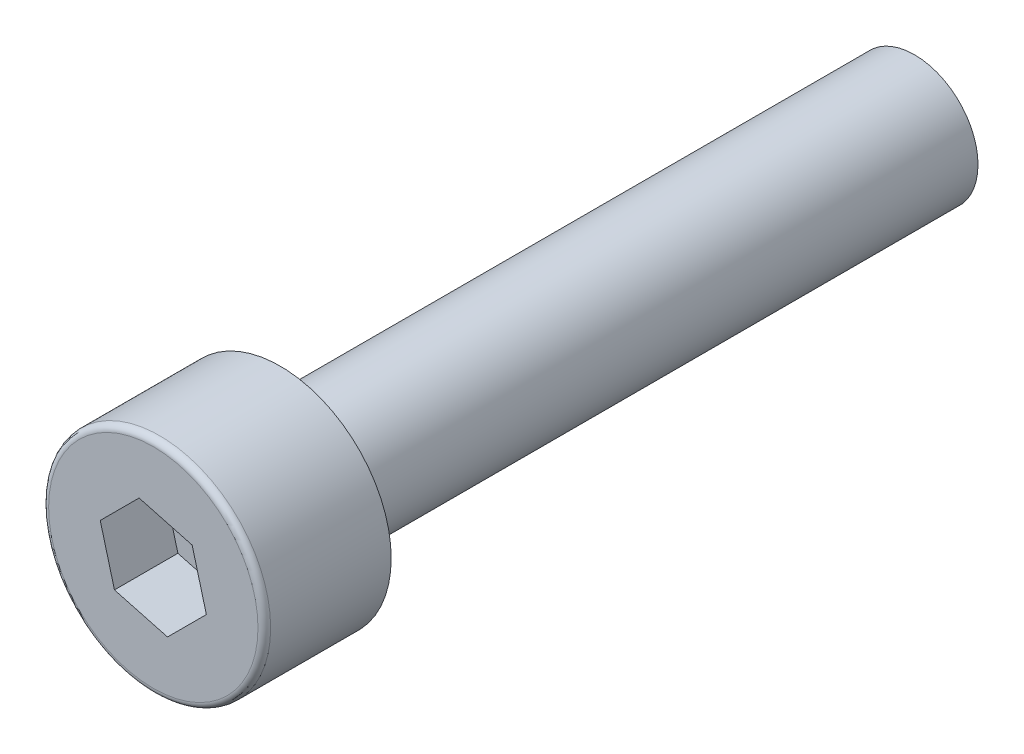
ISO-10303-21;
HEADER;
FILE_DESCRIPTION(('STEP AP214'),'2;1');
FILE_NAME('part.step','',(''),(''),'','','');
FILE_SCHEMA(('AUTOMOTIVE_DESIGN { 1 0 10303 214 1 1 1 1 }'));
ENDSEC;
DATA;
#1=APPLICATION_CONTEXT('core data for automotive mechanical design processes');
#2=APPLICATION_PROTOCOL_DEFINITION('international standard','automotive_design',2000,#1);
#3=PRODUCT_CONTEXT('',#1,'mechanical');
#4=PRODUCT('Part','Part','',(#3));
#5=PRODUCT_RELATED_PRODUCT_CATEGORY('part','',(#4));
#6=PRODUCT_DEFINITION_FORMATION('','',#4);
#7=PRODUCT_DEFINITION_CONTEXT('part definition',#1,'design');
#8=PRODUCT_DEFINITION('design','',#6,#7);
#9=PRODUCT_DEFINITION_SHAPE('','',#8);
#10=(LENGTH_UNIT() NAMED_UNIT(*) SI_UNIT(.MILLI.,.METRE.));
#11=(NAMED_UNIT(*) PLANE_ANGLE_UNIT() SI_UNIT($,.RADIAN.));
#12=(NAMED_UNIT(*) SI_UNIT($,.STERADIAN.) SOLID_ANGLE_UNIT());
#13=UNCERTAINTY_MEASURE_WITH_UNIT(LENGTH_MEASURE(1.E-05),#10,'distance_accuracy_value','');
#14=(GEOMETRIC_REPRESENTATION_CONTEXT(3) GLOBAL_UNCERTAINTY_ASSIGNED_CONTEXT((#13)) GLOBAL_UNIT_ASSIGNED_CONTEXT((#10,
#11,#12)) REPRESENTATION_CONTEXT('',''));
#15=CARTESIAN_POINT('',(0.,0.,0.));
#16=DIRECTION('',(0.,0.,1.));
#17=DIRECTION('',(1.,0.,0.));
#18=AXIS2_PLACEMENT_3D('',#15,#16,#17);
#19=CARTESIAN_POINT('',(0.,0.,0.));
#20=DIRECTION('',(0.,0.,1.));
#21=DIRECTION('',(1.,0.,0.));
#22=AXIS2_PLACEMENT_3D('',#19,#20,#21);
#23=PLANE('',#22);
#24=CARTESIAN_POINT('',(0.,0.,0.));
#25=DIRECTION('',(0.,0.,1.));
#26=DIRECTION('',(1.,0.,0.));
#27=AXIS2_PLACEMENT_3D('',#24,#25,#26);
#28=CIRCLE('',#27,3.5);
#29=CARTESIAN_POINT('',(3.5,0.,0.));
#30=VERTEX_POINT('',#29);
#31=EDGE_CURVE('E137',#30,#30,#28,.T.);
#32=ORIENTED_EDGE('',*,*,#31,.F.);
#33=EDGE_LOOP('',(#32));
#34=FACE_BOUND('',#33,.T.);
#35=CARTESIAN_POINT('',(0.,0.,0.));
#36=DIRECTION('',(0.,0.,1.));
#37=DIRECTION('',(1.,0.,0.));
#38=AXIS2_PLACEMENT_3D('',#35,#36,#37);
#39=CIRCLE('',#38,2.);
#40=CARTESIAN_POINT('',(2.,0.,0.));
#41=VERTEX_POINT('',#40);
#42=EDGE_CURVE('E145',#41,#41,#39,.F.);
#43=ORIENTED_EDGE('',*,*,#42,.F.);
#44=EDGE_LOOP('',(#43));
#45=FACE_BOUND('',#44,.T.);
#46=ADVANCED_FACE('F34',(#34,#45),#23,.F.);
#47=CARTESIAN_POINT('',(0.,0.,4.));
#48=DIRECTION('',(0.,0.,-1.));
#49=DIRECTION('',(-1.,0.,0.));
#50=AXIS2_PLACEMENT_3D('',#47,#48,#49);
#51=CYLINDRICAL_SURFACE('',#50,3.5);
#52=CARTESIAN_POINT('',(0.,0.,3.8));
#53=DIRECTION('',(0.,0.,1.));
#54=DIRECTION('',(1.,0.,0.));
#55=AXIS2_PLACEMENT_3D('',#52,#53,#54);
#56=CIRCLE('',#55,3.5);
#57=CARTESIAN_POINT('',(3.5,0.,3.8));
#58=VERTEX_POINT('',#57);
#59=EDGE_CURVE('E11',#58,#58,#56,.F.);
#60=ORIENTED_EDGE('',*,*,#59,.T.);
#61=EDGE_LOOP('',(#60));
#62=FACE_BOUND('',#61,.T.);
#63=ORIENTED_EDGE('',*,*,#31,.T.);
#64=EDGE_LOOP('',(#63));
#65=FACE_BOUND('',#64,.T.);
#66=ADVANCED_FACE('F164',(#62,#65),#51,.T.);
#67=CARTESIAN_POINT('',(0.,0.,4.));
#68=DIRECTION('',(0.,0.,1.));
#69=DIRECTION('',(1.,0.,0.));
#70=AXIS2_PLACEMENT_3D('',#67,#68,#69);
#71=PLANE('',#70);
#72=CARTESIAN_POINT('',(0.,0.,4.));
#73=DIRECTION('',(0.,0.,1.));
#74=DIRECTION('',(1.,0.,0.));
#75=AXIS2_PLACEMENT_3D('',#72,#73,#74);
#76=CIRCLE('',#75,3.3);
#77=CARTESIAN_POINT('',(3.3,0.,4.));
#78=VERTEX_POINT('',#77);
#79=EDGE_CURVE('E42',#78,#78,#76,.T.);
#80=ORIENTED_EDGE('',*,*,#79,.T.);
#81=EDGE_LOOP('',(#80));
#82=FACE_BOUND('',#81,.T.);
#83=DIRECTION('',(0.258819045102521,-0.965925826289068,0.));
#84=VECTOR('',#83,1.);
#85=CARTESIAN_POINT('',(-1.67303260747562,0.448287736084027,4.));
#86=LINE('',#85,#84);
#87=CARTESIAN_POINT('',(-1.67303260747562,0.448287736084027,4.));
#88=VERTEX_POINT('',#87);
#89=CARTESIAN_POINT('',(-1.22474487139159,-1.22474487139159,4.));
#90=VERTEX_POINT('',#89);
#91=EDGE_CURVE('E49',#88,#90,#86,.T.);
#92=ORIENTED_EDGE('',*,*,#91,.F.);
#93=DIRECTION('',(-0.707106781186547,-0.707106781186548,0.));
#94=VECTOR('',#93,1.);
#95=CARTESIAN_POINT('',(-0.448287736084027,1.67303260747562,4.));
#96=LINE('',#95,#94);
#97=CARTESIAN_POINT('',(-0.448287736084027,1.67303260747562,4.));
#98=VERTEX_POINT('',#97);
#99=EDGE_CURVE('E133',#98,#88,#96,.T.);
#100=ORIENTED_EDGE('',*,*,#99,.F.);
#101=DIRECTION('',(-0.965925826289068,0.258819045102521,0.));
#102=VECTOR('',#101,1.);
#103=CARTESIAN_POINT('',(1.22474487139159,1.22474487139159,4.));
#104=LINE('',#103,#102);
#105=CARTESIAN_POINT('',(1.22474487139159,1.22474487139159,4.));
#106=VERTEX_POINT('',#105);
#107=EDGE_CURVE('E131',#106,#98,#104,.T.);
#108=ORIENTED_EDGE('',*,*,#107,.F.);
#109=DIRECTION('',(-0.258819045102521,0.965925826289068,0.));
#110=VECTOR('',#109,1.);
#111=CARTESIAN_POINT('',(1.67303260747562,-0.448287736084027,4.));
#112=LINE('',#111,#110);
#113=CARTESIAN_POINT('',(1.67303260747562,-0.448287736084027,4.));
#114=VERTEX_POINT('',#113);
#115=EDGE_CURVE('E97',#114,#106,#112,.T.);
#116=ORIENTED_EDGE('',*,*,#115,.F.);
#117=DIRECTION('',(0.707106781186547,0.707106781186548,0.));
#118=VECTOR('',#117,1.);
#119=CARTESIAN_POINT('',(0.448287736084026,-1.67303260747562,4.));
#120=LINE('',#119,#118);
#121=CARTESIAN_POINT('',(0.448287736084026,-1.67303260747562,4.));
#122=VERTEX_POINT('',#121);
#123=EDGE_CURVE('E127',#122,#114,#120,.T.);
#124=ORIENTED_EDGE('',*,*,#123,.F.);
#125=DIRECTION('',(0.965925826289068,-0.258819045102521,0.));
#126=VECTOR('',#125,1.);
#127=CARTESIAN_POINT('',(-1.22474487139159,-1.22474487139159,4.));
#128=LINE('',#127,#126);
#129=EDGE_CURVE('E123',#90,#122,#128,.T.);
#130=ORIENTED_EDGE('',*,*,#129,.F.);
#131=EDGE_LOOP('',(#92,#100,#108,#116,#124,#130));
#132=FACE_BOUND('',#131,.T.);
#133=ADVANCED_FACE('F150',(#82,#132),#71,.T.);
#134=CARTESIAN_POINT('',(-1.67303260747562,0.448287736084027,2.));
#135=DIRECTION('',(-0.965925826289068,-0.258819045102521,0.));
#136=DIRECTION('',(0.258819045102521,-0.965925826289068,0.));
#137=AXIS2_PLACEMENT_3D('',#134,#135,#136);
#138=PLANE('',#137);
#139=ORIENTED_EDGE('',*,*,#91,.T.);
#140=DIRECTION('',(0.,0.,1.));
#141=VECTOR('',#140,1.);
#142=CARTESIAN_POINT('',(-1.22474487139159,-1.22474487139159,2.));
#143=LINE('',#142,#141);
#144=CARTESIAN_POINT('',(-1.22474487139159,-1.22474487139159,2.));
#145=VERTEX_POINT('',#144);
#146=EDGE_CURVE('E79',#145,#90,#143,.T.);
#147=ORIENTED_EDGE('',*,*,#146,.F.);
#148=DIRECTION('',(0.258819045102521,-0.965925826289068,0.));
#149=VECTOR('',#148,1.);
#150=CARTESIAN_POINT('',(-1.67303260747562,0.448287736084027,2.));
#151=LINE('',#150,#149);
#152=CARTESIAN_POINT('',(-1.67303260747562,0.448287736084027,2.));
#153=VERTEX_POINT('',#152);
#154=EDGE_CURVE('E135',#153,#145,#151,.T.);
#155=ORIENTED_EDGE('',*,*,#154,.F.);
#156=DIRECTION('',(0.,0.,1.));
#157=VECTOR('',#156,1.);
#158=CARTESIAN_POINT('',(-1.67303260747562,0.448287736084027,2.));
#159=LINE('',#158,#157);
#160=EDGE_CURVE('E57',#153,#88,#159,.T.);
#161=ORIENTED_EDGE('',*,*,#160,.T.);
#162=EDGE_LOOP('',(#139,#147,#155,#161));
#163=FACE_BOUND('',#162,.T.);
#164=ADVANCED_FACE('F176',(#163),#138,.F.);
#165=CARTESIAN_POINT('',(-0.448287736084027,1.67303260747562,2.));
#166=DIRECTION('',(-0.707106781186548,0.707106781186547,0.));
#167=DIRECTION('',(-0.707106781186547,-0.707106781186548,0.));
#168=AXIS2_PLACEMENT_3D('',#165,#166,#167);
#169=PLANE('',#168);
#170=ORIENTED_EDGE('',*,*,#99,.T.);
#171=ORIENTED_EDGE('',*,*,#160,.F.);
#172=DIRECTION('',(-0.707106781186547,-0.707106781186548,0.));
#173=VECTOR('',#172,1.);
#174=CARTESIAN_POINT('',(-0.448287736084027,1.67303260747562,2.));
#175=LINE('',#174,#173);
#176=CARTESIAN_POINT('',(-0.448287736084027,1.67303260747562,2.));
#177=VERTEX_POINT('',#176);
#178=EDGE_CURVE('E109',#177,#153,#175,.T.);
#179=ORIENTED_EDGE('',*,*,#178,.F.);
#180=DIRECTION('',(0.,0.,1.));
#181=VECTOR('',#180,1.);
#182=CARTESIAN_POINT('',(-0.448287736084027,1.67303260747562,2.));
#183=LINE('',#182,#181);
#184=EDGE_CURVE('E101',#177,#98,#183,.T.);
#185=ORIENTED_EDGE('',*,*,#184,.T.);
#186=EDGE_LOOP('',(#170,#171,#179,#185));
#187=FACE_BOUND('',#186,.T.);
#188=ADVANCED_FACE('F179',(#187),#169,.F.);
#189=CARTESIAN_POINT('',(1.22474487139159,1.22474487139159,2.));
#190=DIRECTION('',(0.258819045102521,0.965925826289068,0.));
#191=DIRECTION('',(-0.965925826289068,0.258819045102521,0.));
#192=AXIS2_PLACEMENT_3D('',#189,#190,#191);
#193=PLANE('',#192);
#194=ORIENTED_EDGE('',*,*,#107,.T.);
#195=ORIENTED_EDGE('',*,*,#184,.F.);
#196=DIRECTION('',(-0.965925826289068,0.258819045102521,0.));
#197=VECTOR('',#196,1.);
#198=CARTESIAN_POINT('',(1.22474487139159,1.22474487139159,2.));
#199=LINE('',#198,#197);
#200=CARTESIAN_POINT('',(1.22474487139159,1.22474487139159,2.));
#201=VERTEX_POINT('',#200);
#202=EDGE_CURVE('E105',#201,#177,#199,.T.);
#203=ORIENTED_EDGE('',*,*,#202,.F.);
#204=DIRECTION('',(0.,0.,1.));
#205=VECTOR('',#204,1.);
#206=CARTESIAN_POINT('',(1.22474487139159,1.22474487139159,2.));
#207=LINE('',#206,#205);
#208=EDGE_CURVE('E90',#201,#106,#207,.T.);
#209=ORIENTED_EDGE('',*,*,#208,.T.);
#210=EDGE_LOOP('',(#194,#195,#203,#209));
#211=FACE_BOUND('',#210,.T.);
#212=ADVANCED_FACE('F106',(#211),#193,.F.);
#213=CARTESIAN_POINT('',(1.67303260747562,-0.448287736084027,2.));
#214=DIRECTION('',(0.965925826289068,0.258819045102521,0.));
#215=DIRECTION('',(-0.258819045102521,0.965925826289068,0.));
#216=AXIS2_PLACEMENT_3D('',#213,#214,#215);
#217=PLANE('',#216);
#218=ORIENTED_EDGE('',*,*,#115,.T.);
#219=ORIENTED_EDGE('',*,*,#208,.F.);
#220=DIRECTION('',(-0.258819045102521,0.965925826289068,0.));
#221=VECTOR('',#220,1.);
#222=CARTESIAN_POINT('',(1.67303260747562,-0.448287736084027,2.));
#223=LINE('',#222,#221);
#224=CARTESIAN_POINT('',(1.67303260747562,-0.448287736084027,2.));
#225=VERTEX_POINT('',#224);
#226=EDGE_CURVE('E94',#225,#201,#223,.T.);
#227=ORIENTED_EDGE('',*,*,#226,.F.);
#228=DIRECTION('',(0.,0.,1.));
#229=VECTOR('',#228,1.);
#230=CARTESIAN_POINT('',(1.67303260747562,-0.448287736084027,2.));
#231=LINE('',#230,#229);
#232=EDGE_CURVE('E102',#225,#114,#231,.T.);
#233=ORIENTED_EDGE('',*,*,#232,.T.);
#234=EDGE_LOOP('',(#218,#219,#227,#233));
#235=FACE_BOUND('',#234,.T.);
#236=ADVANCED_FACE('F92',(#235),#217,.F.);
#237=CARTESIAN_POINT('',(0.448287736084026,-1.67303260747562,2.));
#238=DIRECTION('',(0.707106781186548,-0.707106781186547,0.));
#239=DIRECTION('',(0.707106781186547,0.707106781186548,0.));
#240=AXIS2_PLACEMENT_3D('',#237,#238,#239);
#241=PLANE('',#240);
#242=ORIENTED_EDGE('',*,*,#123,.T.);
#243=ORIENTED_EDGE('',*,*,#232,.F.);
#244=DIRECTION('',(0.707106781186547,0.707106781186548,0.));
#245=VECTOR('',#244,1.);
#246=CARTESIAN_POINT('',(0.448287736084026,-1.67303260747562,2.));
#247=LINE('',#246,#245);
#248=CARTESIAN_POINT('',(0.448287736084026,-1.67303260747562,2.));
#249=VERTEX_POINT('',#248);
#250=EDGE_CURVE('E115',#249,#225,#247,.T.);
#251=ORIENTED_EDGE('',*,*,#250,.F.);
#252=DIRECTION('',(0.,0.,1.));
#253=VECTOR('',#252,1.);
#254=CARTESIAN_POINT('',(0.448287736084026,-1.67303260747562,2.));
#255=LINE('',#254,#253);
#256=EDGE_CURVE('E140',#249,#122,#255,.T.);
#257=ORIENTED_EDGE('',*,*,#256,.T.);
#258=EDGE_LOOP('',(#242,#243,#251,#257));
#259=FACE_BOUND('',#258,.T.);
#260=ADVANCED_FACE('F183',(#259),#241,.F.);
#261=CARTESIAN_POINT('',(-1.22474487139159,-1.22474487139159,2.));
#262=DIRECTION('',(-0.258819045102521,-0.965925826289068,0.));
#263=DIRECTION('',(0.965925826289068,-0.258819045102521,0.));
#264=AXIS2_PLACEMENT_3D('',#261,#262,#263);
#265=PLANE('',#264);
#266=ORIENTED_EDGE('',*,*,#129,.T.);
#267=ORIENTED_EDGE('',*,*,#256,.F.);
#268=DIRECTION('',(0.965925826289068,-0.258819045102521,0.));
#269=VECTOR('',#268,1.);
#270=CARTESIAN_POINT('',(-1.22474487139159,-1.22474487139159,2.));
#271=LINE('',#270,#269);
#272=EDGE_CURVE('E117',#145,#249,#271,.T.);
#273=ORIENTED_EDGE('',*,*,#272,.F.);
#274=ORIENTED_EDGE('',*,*,#146,.T.);
#275=EDGE_LOOP('',(#266,#267,#273,#274));
#276=FACE_BOUND('',#275,.T.);
#277=ADVANCED_FACE('F180',(#276),#265,.F.);
#278=CARTESIAN_POINT('',(0.,0.,2.));
#279=DIRECTION('',(0.,0.,1.));
#280=DIRECTION('',(1.,0.,0.));
#281=AXIS2_PLACEMENT_3D('',#278,#279,#280);
#282=PLANE('',#281);
#283=ORIENTED_EDGE('',*,*,#154,.T.);
#284=ORIENTED_EDGE('',*,*,#272,.T.);
#285=ORIENTED_EDGE('',*,*,#250,.T.);
#286=ORIENTED_EDGE('',*,*,#226,.T.);
#287=ORIENTED_EDGE('',*,*,#202,.T.);
#288=ORIENTED_EDGE('',*,*,#178,.T.);
#289=EDGE_LOOP('',(#283,#284,#285,#286,#287,#288));
#290=FACE_BOUND('',#289,.T.);
#291=ADVANCED_FACE('F112',(#290),#282,.T.);
#292=CARTESIAN_POINT('',(0.,0.,-20.));
#293=DIRECTION('',(0.,0.,1.));
#294=DIRECTION('',(1.,0.,0.));
#295=AXIS2_PLACEMENT_3D('',#292,#293,#294);
#296=CYLINDRICAL_SURFACE('',#295,2.);
#297=CARTESIAN_POINT('',(0.,0.,-20.));
#298=DIRECTION('',(0.,0.,-1.));
#299=DIRECTION('',(-1.,0.,0.));
#300=AXIS2_PLACEMENT_3D('',#297,#298,#299);
#301=CIRCLE('',#300,2.);
#302=CARTESIAN_POINT('',(-2.,0.,-20.));
#303=VERTEX_POINT('',#302);
#304=EDGE_CURVE('E124',#303,#303,#301,.T.);
#305=ORIENTED_EDGE('',*,*,#304,.F.);
#306=EDGE_LOOP('',(#305));
#307=FACE_BOUND('',#306,.T.);
#308=ORIENTED_EDGE('',*,*,#42,.T.);
#309=EDGE_LOOP('',(#308));
#310=FACE_BOUND('',#309,.T.);
#311=ADVANCED_FACE('F159',(#307,#310),#296,.T.);
#312=CARTESIAN_POINT('',(0.,0.,-20.));
#313=DIRECTION('',(0.,0.,-1.));
#314=DIRECTION('',(-1.,0.,0.));
#315=AXIS2_PLACEMENT_3D('',#312,#313,#314);
#316=PLANE('',#315);
#317=ORIENTED_EDGE('',*,*,#304,.T.);
#318=EDGE_LOOP('',(#317));
#319=FACE_BOUND('',#318,.T.);
#320=ADVANCED_FACE('F154',(#319),#316,.T.);
#321=CARTESIAN_POINT('',(0.,0.,3.8));
#322=DIRECTION('',(0.,0.,1.));
#323=DIRECTION('',(1.,0.,0.));
#324=AXIS2_PLACEMENT_3D('',#321,#322,#323);
#325=TOROIDAL_SURFACE('',#324,3.3,0.2);
#326=ORIENTED_EDGE('',*,*,#59,.F.);
#327=EDGE_LOOP('',(#326));
#328=FACE_BOUND('',#327,.T.);
#329=ORIENTED_EDGE('',*,*,#79,.F.);
#330=EDGE_LOOP('',(#329));
#331=FACE_BOUND('',#330,.T.);
#332=ADVANCED_FACE('F36',(#328,#331),#325,.T.);
#333=CLOSED_SHELL('',(#46,#66,#133,#164,#188,#212,#236,#260,#277,#291,#311,#320,#332));
#334=MANIFOLD_SOLID_BREP('B2',#333);
#335=ADVANCED_BREP_SHAPE_REPRESENTATION('',(#18,#334),#14);
#336=SHAPE_DEFINITION_REPRESENTATION(#9,#335);
ENDSEC;
END-ISO-10303-21;
